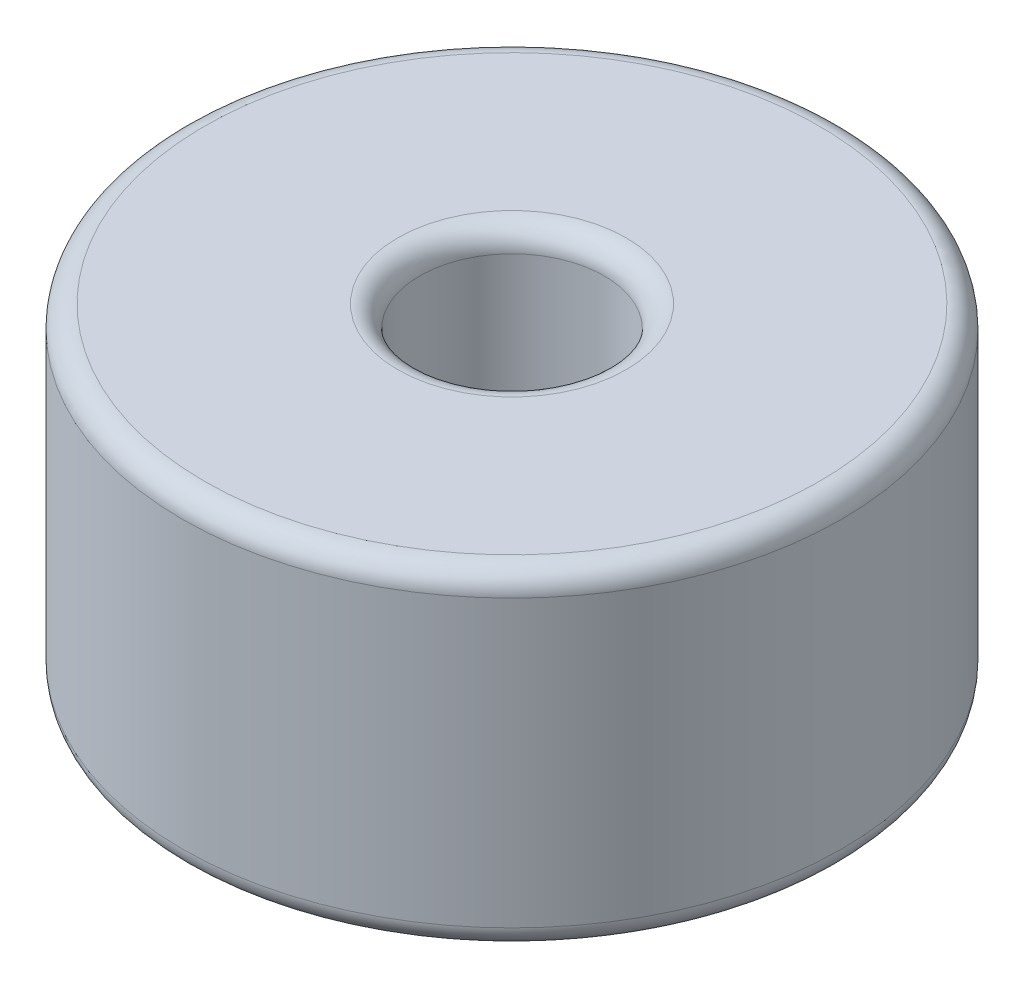
ISO-10303-21;
HEADER;
FILE_DESCRIPTION(('STEP AP214'),'2;1');
FILE_NAME('part.step','',(''),(''),'','','');
FILE_SCHEMA(('AUTOMOTIVE_DESIGN { 1 0 10303 214 1 1 1 1 }'));
ENDSEC;
DATA;
#1=APPLICATION_CONTEXT('core data for automotive mechanical design processes');
#2=APPLICATION_PROTOCOL_DEFINITION('international standard','automotive_design',2000,#1);
#3=PRODUCT_CONTEXT('',#1,'mechanical');
#4=PRODUCT('Part','Part','',(#3));
#5=PRODUCT_RELATED_PRODUCT_CATEGORY('part','',(#4));
#6=PRODUCT_DEFINITION_FORMATION('','',#4);
#7=PRODUCT_DEFINITION_CONTEXT('part definition',#1,'design');
#8=PRODUCT_DEFINITION('design','',#6,#7);
#9=PRODUCT_DEFINITION_SHAPE('','',#8);
#10=(LENGTH_UNIT() NAMED_UNIT(*) SI_UNIT(.MILLI.,.METRE.));
#11=(NAMED_UNIT(*) PLANE_ANGLE_UNIT() SI_UNIT($,.RADIAN.));
#12=(NAMED_UNIT(*) SI_UNIT($,.STERADIAN.) SOLID_ANGLE_UNIT());
#13=UNCERTAINTY_MEASURE_WITH_UNIT(LENGTH_MEASURE(1.E-05),#10,'distance_accuracy_value','');
#14=(GEOMETRIC_REPRESENTATION_CONTEXT(3) GLOBAL_UNCERTAINTY_ASSIGNED_CONTEXT((#13)) GLOBAL_UNIT_ASSIGNED_CONTEXT((#10,
#11,#12)) REPRESENTATION_CONTEXT('',''));
#15=CARTESIAN_POINT('',(0.,0.,0.));
#16=DIRECTION('',(0.,0.,1.));
#17=DIRECTION('',(1.,0.,0.));
#18=AXIS2_PLACEMENT_3D('',#15,#16,#17);
#19=CARTESIAN_POINT('',(0.,7.5,0.));
#20=DIRECTION('',(0.,1.,0.));
#21=DIRECTION('',(0.,0.,1.));
#22=AXIS2_PLACEMENT_3D('',#19,#20,#21);
#23=PLANE('',#22);
#24=CARTESIAN_POINT('',(0.,7.5,0.));
#25=DIRECTION('',(0.,1.,0.));
#26=DIRECTION('',(0.,0.,1.));
#27=AXIS2_PLACEMENT_3D('',#24,#25,#26);
#28=CIRCLE('',#27,2.6);
#29=CARTESIAN_POINT('',(0.,7.5,2.6));
#30=VERTEX_POINT('',#29);
#31=EDGE_CURVE('E42',#30,#30,#28,.F.);
#32=ORIENTED_EDGE('',*,*,#31,.T.);
#33=EDGE_LOOP('',(#32));
#34=FACE_BOUND('',#33,.T.);
#35=CARTESIAN_POINT('',(0.,7.5,0.));
#36=DIRECTION('',(0.,1.,0.));
#37=DIRECTION('',(0.,0.,1.));
#38=AXIS2_PLACEMENT_3D('',#35,#36,#37);
#39=CIRCLE('',#38,7.);
#40=CARTESIAN_POINT('',(0.,7.5,7.));
#41=VERTEX_POINT('',#40);
#42=EDGE_CURVE('E46',#41,#41,#39,.T.);
#43=ORIENTED_EDGE('',*,*,#42,.T.);
#44=EDGE_LOOP('',(#43));
#45=FACE_BOUND('',#44,.T.);
#46=ADVANCED_FACE('F31',(#34,#45),#23,.T.);
#47=CARTESIAN_POINT('',(0.,0.,0.));
#48=DIRECTION('',(0.,1.,0.));
#49=DIRECTION('',(0.,0.,1.));
#50=AXIS2_PLACEMENT_3D('',#47,#48,#49);
#51=PLANE('',#50);
#52=CARTESIAN_POINT('',(0.,0.,0.));
#53=DIRECTION('',(0.,1.,0.));
#54=DIRECTION('',(0.,0.,1.));
#55=AXIS2_PLACEMENT_3D('',#52,#53,#54);
#56=CIRCLE('',#55,2.6);
#57=CARTESIAN_POINT('',(0.,0.,2.6));
#58=VERTEX_POINT('',#57);
#59=EDGE_CURVE('E57',#58,#58,#56,.T.);
#60=ORIENTED_EDGE('',*,*,#59,.T.);
#61=EDGE_LOOP('',(#60));
#62=FACE_BOUND('',#61,.T.);
#63=CARTESIAN_POINT('',(0.,0.,0.));
#64=DIRECTION('',(0.,1.,0.));
#65=DIRECTION('',(0.,0.,1.));
#66=AXIS2_PLACEMENT_3D('',#63,#64,#65);
#67=CIRCLE('',#66,7.);
#68=CARTESIAN_POINT('',(0.,0.,7.));
#69=VERTEX_POINT('',#68);
#70=EDGE_CURVE('E60',#69,#69,#67,.F.);
#71=ORIENTED_EDGE('',*,*,#70,.T.);
#72=EDGE_LOOP('',(#71));
#73=FACE_BOUND('',#72,.T.);
#74=ADVANCED_FACE('F64',(#62,#73),#51,.F.);
#75=CARTESIAN_POINT('',(0.,7.5,0.));
#76=DIRECTION('',(0.,-1.,0.));
#77=DIRECTION('',(0.,0.,-1.));
#78=AXIS2_PLACEMENT_3D('',#75,#76,#77);
#79=CYLINDRICAL_SURFACE('',#78,7.5);
#80=CARTESIAN_POINT('',(0.,0.5,0.));
#81=DIRECTION('',(0.,1.,0.));
#82=DIRECTION('',(0.,0.,1.));
#83=AXIS2_PLACEMENT_3D('',#80,#81,#82);
#84=CIRCLE('',#83,7.5);
#85=CARTESIAN_POINT('',(0.,0.5,7.5));
#86=VERTEX_POINT('',#85);
#87=EDGE_CURVE('E10',#86,#86,#84,.T.);
#88=ORIENTED_EDGE('',*,*,#87,.T.);
#89=EDGE_LOOP('',(#88));
#90=FACE_BOUND('',#89,.T.);
#91=CARTESIAN_POINT('',(0.,7.,0.));
#92=DIRECTION('',(0.,1.,0.));
#93=DIRECTION('',(0.,0.,1.));
#94=AXIS2_PLACEMENT_3D('',#91,#92,#93);
#95=CIRCLE('',#94,7.5);
#96=CARTESIAN_POINT('',(0.,7.,7.5));
#97=VERTEX_POINT('',#96);
#98=EDGE_CURVE('E38',#97,#97,#95,.F.);
#99=ORIENTED_EDGE('',*,*,#98,.T.);
#100=EDGE_LOOP('',(#99));
#101=FACE_BOUND('',#100,.T.);
#102=ADVANCED_FACE('F84',(#90,#101),#79,.T.);
#103=CARTESIAN_POINT('',(0.,7.5,0.));
#104=DIRECTION('',(0.,-1.,0.));
#105=DIRECTION('',(0.,0.,-1.));
#106=AXIS2_PLACEMENT_3D('',#103,#104,#105);
#107=CYLINDRICAL_SURFACE('',#106,2.1);
#108=CARTESIAN_POINT('',(0.,0.5,0.));
#109=DIRECTION('',(0.,1.,0.));
#110=DIRECTION('',(0.,0.,1.));
#111=AXIS2_PLACEMENT_3D('',#108,#109,#110);
#112=CIRCLE('',#111,2.1);
#113=CARTESIAN_POINT('',(0.,0.5,2.1));
#114=VERTEX_POINT('',#113);
#115=EDGE_CURVE('E51',#114,#114,#112,.F.);
#116=ORIENTED_EDGE('',*,*,#115,.T.);
#117=EDGE_LOOP('',(#116));
#118=FACE_BOUND('',#117,.T.);
#119=CARTESIAN_POINT('',(0.,7.,0.));
#120=DIRECTION('',(0.,1.,0.));
#121=DIRECTION('',(0.,0.,1.));
#122=AXIS2_PLACEMENT_3D('',#119,#120,#121);
#123=CIRCLE('',#122,2.1);
#124=CARTESIAN_POINT('',(0.,7.,2.1));
#125=VERTEX_POINT('',#124);
#126=EDGE_CURVE('E54',#125,#125,#123,.T.);
#127=ORIENTED_EDGE('',*,*,#126,.T.);
#128=EDGE_LOOP('',(#127));
#129=FACE_BOUND('',#128,.T.);
#130=ADVANCED_FACE('F89',(#118,#129),#107,.F.);
#131=CARTESIAN_POINT('',(0.,0.5,0.));
#132=DIRECTION('',(0.,1.,0.));
#133=DIRECTION('',(0.,0.,1.));
#134=AXIS2_PLACEMENT_3D('',#131,#132,#133);
#135=TOROIDAL_SURFACE('',#134,2.6,0.5);
#136=ORIENTED_EDGE('',*,*,#115,.F.);
#137=EDGE_LOOP('',(#136));
#138=FACE_BOUND('',#137,.T.);
#139=ORIENTED_EDGE('',*,*,#59,.F.);
#140=EDGE_LOOP('',(#139));
#141=FACE_BOUND('',#140,.T.);
#142=ADVANCED_FACE('F75',(#138,#141),#135,.T.);
#143=CARTESIAN_POINT('',(0.,7.,0.));
#144=DIRECTION('',(0.,1.,0.));
#145=DIRECTION('',(0.,0.,1.));
#146=AXIS2_PLACEMENT_3D('',#143,#144,#145);
#147=TOROIDAL_SURFACE('',#146,2.6,0.5);
#148=ORIENTED_EDGE('',*,*,#31,.F.);
#149=EDGE_LOOP('',(#148));
#150=FACE_BOUND('',#149,.T.);
#151=ORIENTED_EDGE('',*,*,#126,.F.);
#152=EDGE_LOOP('',(#151));
#153=FACE_BOUND('',#152,.T.);
#154=ADVANCED_FACE('F69',(#150,#153),#147,.T.);
#155=CARTESIAN_POINT('',(0.,0.5,0.));
#156=DIRECTION('',(0.,1.,0.));
#157=DIRECTION('',(0.,0.,1.));
#158=AXIS2_PLACEMENT_3D('',#155,#156,#157);
#159=TOROIDAL_SURFACE('',#158,7.,0.5);
#160=ORIENTED_EDGE('',*,*,#70,.F.);
#161=EDGE_LOOP('',(#160));
#162=FACE_BOUND('',#161,.T.);
#163=ORIENTED_EDGE('',*,*,#87,.F.);
#164=EDGE_LOOP('',(#163));
#165=FACE_BOUND('',#164,.T.);
#166=ADVANCED_FACE('F66',(#162,#165),#159,.T.);
#167=CARTESIAN_POINT('',(0.,7.,0.));
#168=DIRECTION('',(0.,1.,0.));
#169=DIRECTION('',(0.,0.,1.));
#170=AXIS2_PLACEMENT_3D('',#167,#168,#169);
#171=TOROIDAL_SURFACE('',#170,7.,0.5);
#172=ORIENTED_EDGE('',*,*,#98,.F.);
#173=EDGE_LOOP('',(#172));
#174=FACE_BOUND('',#173,.T.);
#175=ORIENTED_EDGE('',*,*,#42,.F.);
#176=EDGE_LOOP('',(#175));
#177=FACE_BOUND('',#176,.T.);
#178=ADVANCED_FACE('F33',(#174,#177),#171,.T.);
#179=CLOSED_SHELL('',(#46,#74,#102,#130,#142,#154,#166,#178));
#180=MANIFOLD_SOLID_BREP('B2',#179);
#181=ADVANCED_BREP_SHAPE_REPRESENTATION('',(#18,#180),#14);
#182=SHAPE_DEFINITION_REPRESENTATION(#9,#181);
ENDSEC;
END-ISO-10303-21;
